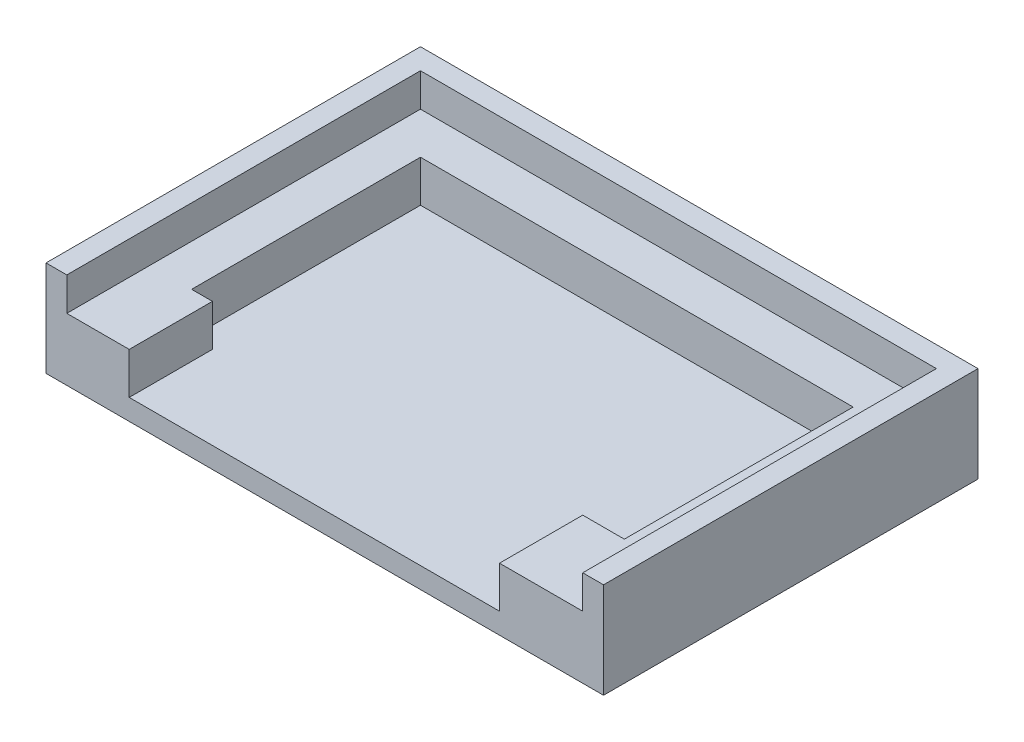
ISO-10303-21;
HEADER;
FILE_DESCRIPTION(('STEP AP214'),'2;1');
FILE_NAME('part.step','',(''),(''),'','','');
FILE_SCHEMA(('AUTOMOTIVE_DESIGN { 1 0 10303 214 1 1 1 1 }'));
ENDSEC;
DATA;
#1=APPLICATION_CONTEXT('core data for automotive mechanical design processes');
#2=APPLICATION_PROTOCOL_DEFINITION('international standard','automotive_design',2000,#1);
#3=PRODUCT_CONTEXT('',#1,'mechanical');
#4=PRODUCT('Part','Part','',(#3));
#5=PRODUCT_RELATED_PRODUCT_CATEGORY('part','',(#4));
#6=PRODUCT_DEFINITION_FORMATION('','',#4);
#7=PRODUCT_DEFINITION_CONTEXT('part definition',#1,'design');
#8=PRODUCT_DEFINITION('design','',#6,#7);
#9=PRODUCT_DEFINITION_SHAPE('','',#8);
#10=(LENGTH_UNIT() NAMED_UNIT(*) SI_UNIT(.MILLI.,.METRE.));
#11=(NAMED_UNIT(*) PLANE_ANGLE_UNIT() SI_UNIT($,.RADIAN.));
#12=(NAMED_UNIT(*) SI_UNIT($,.STERADIAN.) SOLID_ANGLE_UNIT());
#13=UNCERTAINTY_MEASURE_WITH_UNIT(LENGTH_MEASURE(1.E-05),#10,'distance_accuracy_value','');
#14=(GEOMETRIC_REPRESENTATION_CONTEXT(3) GLOBAL_UNCERTAINTY_ASSIGNED_CONTEXT((#13)) GLOBAL_UNIT_ASSIGNED_CONTEXT((#10,
#11,#12)) REPRESENTATION_CONTEXT('',''));
#15=CARTESIAN_POINT('',(0.,0.,0.));
#16=DIRECTION('',(0.,0.,1.));
#17=DIRECTION('',(1.,0.,0.));
#18=AXIS2_PLACEMENT_3D('',#15,#16,#17);
#19=CARTESIAN_POINT('',(67.,5.,45.));
#20=DIRECTION('',(-1.,0.,0.));
#21=DIRECTION('',(0.,0.,1.));
#22=AXIS2_PLACEMENT_3D('',#19,#20,#21);
#23=PLANE('',#22);
#24=DIRECTION('',(0.,0.,-1.));
#25=VECTOR('',#24,1.);
#26=CARTESIAN_POINT('',(67.,0.,45.));
#27=LINE('',#26,#25);
#28=CARTESIAN_POINT('',(67.,0.,45.));
#29=VERTEX_POINT('',#28);
#30=CARTESIAN_POINT('',(67.,0.,-45.));
#31=VERTEX_POINT('',#30);
#32=EDGE_CURVE('E254',#29,#31,#27,.T.);
#33=ORIENTED_EDGE('',*,*,#32,.T.);
#34=DIRECTION('',(0.,-1.,0.));
#35=VECTOR('',#34,1.);
#36=CARTESIAN_POINT('',(67.,5.,-45.));
#37=LINE('',#36,#35);
#38=CARTESIAN_POINT('',(67.,23.,-45.));
#39=VERTEX_POINT('',#38);
#40=EDGE_CURVE('E11',#39,#31,#37,.T.);
#41=ORIENTED_EDGE('',*,*,#40,.F.);
#42=DIRECTION('',(0.,0.,-1.));
#43=VECTOR('',#42,1.);
#44=CARTESIAN_POINT('',(67.,23.,0.));
#45=LINE('',#44,#43);
#46=CARTESIAN_POINT('',(67.,23.,45.));
#47=VERTEX_POINT('',#46);
#48=EDGE_CURVE('E169',#47,#39,#45,.T.);
#49=ORIENTED_EDGE('',*,*,#48,.F.);
#50=DIRECTION('',(0.,-1.,0.));
#51=VECTOR('',#50,1.);
#52=CARTESIAN_POINT('',(67.,5.,45.));
#53=LINE('',#52,#51);
#54=EDGE_CURVE('E257',#47,#29,#53,.T.);
#55=ORIENTED_EDGE('',*,*,#54,.T.);
#56=EDGE_LOOP('',(#33,#41,#49,#55));
#57=FACE_BOUND('',#56,.T.);
#58=ADVANCED_FACE('F35',(#57),#23,.F.);
#59=CARTESIAN_POINT('',(-67.,5.,-45.));
#60=DIRECTION('',(0.,0.,1.));
#61=DIRECTION('',(1.,0.,0.));
#62=AXIS2_PLACEMENT_3D('',#59,#60,#61);
#63=PLANE('',#62);
#64=DIRECTION('',(-1.,0.,0.));
#65=VECTOR('',#64,1.);
#66=CARTESIAN_POINT('',(-67.,0.,-45.));
#67=LINE('',#66,#65);
#68=CARTESIAN_POINT('',(-67.,0.,-45.));
#69=VERTEX_POINT('',#68);
#70=EDGE_CURVE('E261',#31,#69,#67,.T.);
#71=ORIENTED_EDGE('',*,*,#70,.T.);
#72=DIRECTION('',(0.,-1.,0.));
#73=VECTOR('',#72,1.);
#74=CARTESIAN_POINT('',(-67.,5.,-45.));
#75=LINE('',#74,#73);
#76=CARTESIAN_POINT('',(-67.,23.,-45.));
#77=VERTEX_POINT('',#76);
#78=EDGE_CURVE('E42',#77,#69,#75,.T.);
#79=ORIENTED_EDGE('',*,*,#78,.F.);
#80=DIRECTION('',(-1.,0.,0.));
#81=VECTOR('',#80,1.);
#82=CARTESIAN_POINT('',(0.,23.,-45.));
#83=LINE('',#82,#81);
#84=EDGE_CURVE('E174',#39,#77,#83,.T.);
#85=ORIENTED_EDGE('',*,*,#84,.F.);
#86=ORIENTED_EDGE('',*,*,#40,.T.);
#87=EDGE_LOOP('',(#71,#79,#85,#86));
#88=FACE_BOUND('',#87,.T.);
#89=ADVANCED_FACE('F286',(#88),#63,.F.);
#90=CARTESIAN_POINT('',(-67.,5.,45.));
#91=DIRECTION('',(1.,0.,0.));
#92=DIRECTION('',(0.,0.,-1.));
#93=AXIS2_PLACEMENT_3D('',#90,#91,#92);
#94=PLANE('',#93);
#95=DIRECTION('',(0.,0.,1.));
#96=VECTOR('',#95,1.);
#97=CARTESIAN_POINT('',(-67.,0.,45.));
#98=LINE('',#97,#96);
#99=CARTESIAN_POINT('',(-67.,0.,45.));
#100=VERTEX_POINT('',#99);
#101=EDGE_CURVE('E263',#69,#100,#98,.T.);
#102=ORIENTED_EDGE('',*,*,#101,.T.);
#103=DIRECTION('',(0.,-1.,0.));
#104=VECTOR('',#103,1.);
#105=CARTESIAN_POINT('',(-67.,5.,45.));
#106=LINE('',#105,#104);
#107=CARTESIAN_POINT('',(-67.,23.,45.));
#108=VERTEX_POINT('',#107);
#109=EDGE_CURVE('E268',#108,#100,#106,.T.);
#110=ORIENTED_EDGE('',*,*,#109,.F.);
#111=DIRECTION('',(0.,0.,1.));
#112=VECTOR('',#111,1.);
#113=CARTESIAN_POINT('',(-67.,23.,0.));
#114=LINE('',#113,#112);
#115=EDGE_CURVE('E177',#77,#108,#114,.T.);
#116=ORIENTED_EDGE('',*,*,#115,.F.);
#117=ORIENTED_EDGE('',*,*,#78,.T.);
#118=EDGE_LOOP('',(#102,#110,#116,#117));
#119=FACE_BOUND('',#118,.T.);
#120=ADVANCED_FACE('F274',(#119),#94,.F.);
#121=CARTESIAN_POINT('',(-67.,5.,45.));
#122=DIRECTION('',(0.,0.,-1.));
#123=DIRECTION('',(-1.,0.,0.));
#124=AXIS2_PLACEMENT_3D('',#121,#122,#123);
#125=PLANE('',#124);
#126=DIRECTION('',(1.,0.,0.));
#127=VECTOR('',#126,1.);
#128=CARTESIAN_POINT('',(-67.,0.,45.));
#129=LINE('',#128,#127);
#130=EDGE_CURVE('E258',#100,#29,#129,.T.);
#131=ORIENTED_EDGE('',*,*,#130,.T.);
#132=ORIENTED_EDGE('',*,*,#54,.F.);
#133=DIRECTION('',(1.,0.,0.));
#134=VECTOR('',#133,1.);
#135=CARTESIAN_POINT('',(0.,23.,45.));
#136=LINE('',#135,#134);
#137=CARTESIAN_POINT('',(62.,23.,45.));
#138=VERTEX_POINT('',#137);
#139=EDGE_CURVE('E167',#138,#47,#136,.T.);
#140=ORIENTED_EDGE('',*,*,#139,.F.);
#141=DIRECTION('',(0.,-1.,0.));
#142=VECTOR('',#141,1.);
#143=CARTESIAN_POINT('',(62.,23.,45.));
#144=LINE('',#143,#142);
#145=CARTESIAN_POINT('',(62.,15.,45.));
#146=VERTEX_POINT('',#145);
#147=EDGE_CURVE('E153',#138,#146,#144,.T.);
#148=ORIENTED_EDGE('',*,*,#147,.T.);
#149=DIRECTION('',(1.,0.,0.));
#150=VECTOR('',#149,1.);
#151=CARTESIAN_POINT('',(0.,15.,45.));
#152=LINE('',#151,#150);
#153=CARTESIAN_POINT('',(42.,15.,45.));
#154=VERTEX_POINT('',#153);
#155=EDGE_CURVE('E196',#154,#146,#152,.T.);
#156=ORIENTED_EDGE('',*,*,#155,.F.);
#157=DIRECTION('',(0.,-1.,0.));
#158=VECTOR('',#157,1.);
#159=CARTESIAN_POINT('',(42.,15.,45.));
#160=LINE('',#159,#158);
#161=CARTESIAN_POINT('',(42.,5.,45.));
#162=VERTEX_POINT('',#161);
#163=EDGE_CURVE('E251',#154,#162,#160,.T.);
#164=ORIENTED_EDGE('',*,*,#163,.T.);
#165=DIRECTION('',(1.,0.,0.));
#166=VECTOR('',#165,1.);
#167=CARTESIAN_POINT('',(-67.,5.,45.));
#168=LINE('',#167,#166);
#169=CARTESIAN_POINT('',(-47.,5.,45.));
#170=VERTEX_POINT('',#169);
#171=EDGE_CURVE('E255',#170,#162,#168,.T.);
#172=ORIENTED_EDGE('',*,*,#171,.F.);
#173=DIRECTION('',(0.,-1.,0.));
#174=VECTOR('',#173,1.);
#175=CARTESIAN_POINT('',(-47.,15.,45.));
#176=LINE('',#175,#174);
#177=CARTESIAN_POINT('',(-47.,15.,45.));
#178=VERTEX_POINT('',#177);
#179=EDGE_CURVE('E248',#178,#170,#176,.T.);
#180=ORIENTED_EDGE('',*,*,#179,.F.);
#181=CARTESIAN_POINT('',(-62.,15.,45.));
#182=VERTEX_POINT('',#181);
#183=EDGE_CURVE('E200',#182,#178,#152,.T.);
#184=ORIENTED_EDGE('',*,*,#183,.F.);
#185=DIRECTION('',(0.,-1.,0.));
#186=VECTOR('',#185,1.);
#187=CARTESIAN_POINT('',(-62.,23.,45.));
#188=LINE('',#187,#186);
#189=CARTESIAN_POINT('',(-62.,23.,45.));
#190=VERTEX_POINT('',#189);
#191=EDGE_CURVE('E190',#190,#182,#188,.T.);
#192=ORIENTED_EDGE('',*,*,#191,.F.);
#193=DIRECTION('',(1.,0.,0.));
#194=VECTOR('',#193,1.);
#195=CARTESIAN_POINT('',(0.,23.,45.));
#196=LINE('',#195,#194);
#197=EDGE_CURVE('E180',#108,#190,#196,.T.);
#198=ORIENTED_EDGE('',*,*,#197,.F.);
#199=ORIENTED_EDGE('',*,*,#109,.T.);
#200=EDGE_LOOP('',(#131,#132,#140,#148,#156,#164,#172,#180,#184,#192,#198,#199));
#201=FACE_BOUND('',#200,.T.);
#202=ADVANCED_FACE('F282',(#201),#125,.F.);
#203=CARTESIAN_POINT('',(0.,5.,0.));
#204=DIRECTION('',(0.,-1.,0.));
#205=DIRECTION('',(0.,0.,-1.));
#206=AXIS2_PLACEMENT_3D('',#203,#204,#205);
#207=PLANE('',#206);
#208=ORIENTED_EDGE('',*,*,#171,.T.);
#209=DIRECTION('',(0.,0.,-1.));
#210=VECTOR('',#209,1.);
#211=CARTESIAN_POINT('',(42.,5.,0.));
#212=LINE('',#211,#210);
#213=CARTESIAN_POINT('',(42.,5.,25.));
#214=VERTEX_POINT('',#213);
#215=EDGE_CURVE('E57',#162,#214,#212,.T.);
#216=ORIENTED_EDGE('',*,*,#215,.T.);
#217=DIRECTION('',(-1.,0.,0.));
#218=VECTOR('',#217,1.);
#219=CARTESIAN_POINT('',(0.,5.,25.));
#220=LINE('',#219,#218);
#221=CARTESIAN_POINT('',(52.,5.,25.));
#222=VERTEX_POINT('',#221);
#223=EDGE_CURVE('E197',#222,#214,#220,.T.);
#224=ORIENTED_EDGE('',*,*,#223,.F.);
#225=DIRECTION('',(0.,0.,-1.));
#226=VECTOR('',#225,1.);
#227=CARTESIAN_POINT('',(52.,5.,0.));
#228=LINE('',#227,#226);
#229=CARTESIAN_POINT('',(52.,5.,-30.));
#230=VERTEX_POINT('',#229);
#231=EDGE_CURVE('E228',#222,#230,#228,.T.);
#232=ORIENTED_EDGE('',*,*,#231,.T.);
#233=DIRECTION('',(1.,0.,0.));
#234=VECTOR('',#233,1.);
#235=CARTESIAN_POINT('',(0.,5.,-30.));
#236=LINE('',#235,#234);
#237=CARTESIAN_POINT('',(-52.,5.,-30.));
#238=VERTEX_POINT('',#237);
#239=EDGE_CURVE('E225',#238,#230,#236,.T.);
#240=ORIENTED_EDGE('',*,*,#239,.F.);
#241=DIRECTION('',(0.,0.,-1.));
#242=VECTOR('',#241,1.);
#243=CARTESIAN_POINT('',(-52.,5.,0.));
#244=LINE('',#243,#242);
#245=CARTESIAN_POINT('',(-52.,5.,25.));
#246=VERTEX_POINT('',#245);
#247=EDGE_CURVE('E222',#246,#238,#244,.T.);
#248=ORIENTED_EDGE('',*,*,#247,.F.);
#249=DIRECTION('',(-1.,0.,0.));
#250=VECTOR('',#249,1.);
#251=CARTESIAN_POINT('',(0.,5.,25.));
#252=LINE('',#251,#250);
#253=CARTESIAN_POINT('',(-47.,5.,25.));
#254=VERTEX_POINT('',#253);
#255=EDGE_CURVE('E219',#254,#246,#252,.T.);
#256=ORIENTED_EDGE('',*,*,#255,.F.);
#257=DIRECTION('',(0.,0.,-1.));
#258=VECTOR('',#257,1.);
#259=CARTESIAN_POINT('',(-47.,5.,0.));
#260=LINE('',#259,#258);
#261=EDGE_CURVE('E216',#170,#254,#260,.T.);
#262=ORIENTED_EDGE('',*,*,#261,.F.);
#263=EDGE_LOOP('',(#208,#216,#224,#232,#240,#248,#256,#262));
#264=FACE_BOUND('',#263,.T.);
#265=ADVANCED_FACE('F296',(#264),#207,.F.);
#266=CARTESIAN_POINT('',(0.,0.,0.));
#267=DIRECTION('',(0.,-1.,0.));
#268=DIRECTION('',(0.,0.,-1.));
#269=AXIS2_PLACEMENT_3D('',#266,#267,#268);
#270=PLANE('',#269);
#271=ORIENTED_EDGE('',*,*,#32,.F.);
#272=ORIENTED_EDGE('',*,*,#130,.F.);
#273=ORIENTED_EDGE('',*,*,#101,.F.);
#274=ORIENTED_EDGE('',*,*,#70,.F.);
#275=EDGE_LOOP('',(#271,#272,#273,#274));
#276=FACE_BOUND('',#275,.T.);
#277=ADVANCED_FACE('F280',(#276),#270,.T.);
#278=CARTESIAN_POINT('',(42.,15.,0.));
#279=DIRECTION('',(-1.,0.,0.));
#280=DIRECTION('',(0.,0.,1.));
#281=AXIS2_PLACEMENT_3D('',#278,#279,#280);
#282=PLANE('',#281);
#283=ORIENTED_EDGE('',*,*,#215,.F.);
#284=ORIENTED_EDGE('',*,*,#163,.F.);
#285=DIRECTION('',(0.,0.,-1.));
#286=VECTOR('',#285,1.);
#287=CARTESIAN_POINT('',(42.,15.,0.));
#288=LINE('',#287,#286);
#289=CARTESIAN_POINT('',(42.,15.,25.));
#290=VERTEX_POINT('',#289);
#291=EDGE_CURVE('E193',#154,#290,#288,.T.);
#292=ORIENTED_EDGE('',*,*,#291,.T.);
#293=DIRECTION('',(0.,-1.,0.));
#294=VECTOR('',#293,1.);
#295=CARTESIAN_POINT('',(42.,15.,25.));
#296=LINE('',#295,#294);
#297=EDGE_CURVE('E214',#290,#214,#296,.T.);
#298=ORIENTED_EDGE('',*,*,#297,.T.);
#299=EDGE_LOOP('',(#283,#284,#292,#298));
#300=FACE_BOUND('',#299,.T.);
#301=ADVANCED_FACE('F299',(#300),#282,.T.);
#302=CARTESIAN_POINT('',(-47.,15.,0.));
#303=DIRECTION('',(-1.,0.,0.));
#304=DIRECTION('',(0.,0.,1.));
#305=AXIS2_PLACEMENT_3D('',#302,#303,#304);
#306=PLANE('',#305);
#307=ORIENTED_EDGE('',*,*,#261,.T.);
#308=DIRECTION('',(0.,-1.,0.));
#309=VECTOR('',#308,1.);
#310=CARTESIAN_POINT('',(-47.,15.,25.));
#311=LINE('',#310,#309);
#312=CARTESIAN_POINT('',(-47.,15.,25.));
#313=VERTEX_POINT('',#312);
#314=EDGE_CURVE('E245',#313,#254,#311,.T.);
#315=ORIENTED_EDGE('',*,*,#314,.F.);
#316=DIRECTION('',(0.,0.,-1.));
#317=VECTOR('',#316,1.);
#318=CARTESIAN_POINT('',(-47.,15.,0.));
#319=LINE('',#318,#317);
#320=EDGE_CURVE('E201',#178,#313,#319,.T.);
#321=ORIENTED_EDGE('',*,*,#320,.F.);
#322=ORIENTED_EDGE('',*,*,#179,.T.);
#323=EDGE_LOOP('',(#307,#315,#321,#322));
#324=FACE_BOUND('',#323,.T.);
#325=ADVANCED_FACE('F304',(#324),#306,.F.);
#326=CARTESIAN_POINT('',(0.,15.,25.));
#327=DIRECTION('',(0.,0.,1.));
#328=DIRECTION('',(1.,0.,0.));
#329=AXIS2_PLACEMENT_3D('',#326,#327,#328);
#330=PLANE('',#329);
#331=ORIENTED_EDGE('',*,*,#255,.T.);
#332=DIRECTION('',(0.,-1.,0.));
#333=VECTOR('',#332,1.);
#334=CARTESIAN_POINT('',(-52.,15.,25.));
#335=LINE('',#334,#333);
#336=CARTESIAN_POINT('',(-52.,15.,25.));
#337=VERTEX_POINT('',#336);
#338=EDGE_CURVE('E242',#337,#246,#335,.T.);
#339=ORIENTED_EDGE('',*,*,#338,.F.);
#340=DIRECTION('',(-1.,0.,0.));
#341=VECTOR('',#340,1.);
#342=CARTESIAN_POINT('',(0.,15.,25.));
#343=LINE('',#342,#341);
#344=EDGE_CURVE('E203',#313,#337,#343,.T.);
#345=ORIENTED_EDGE('',*,*,#344,.F.);
#346=ORIENTED_EDGE('',*,*,#314,.T.);
#347=EDGE_LOOP('',(#331,#339,#345,#346));
#348=FACE_BOUND('',#347,.T.);
#349=ADVANCED_FACE('F308',(#348),#330,.F.);
#350=CARTESIAN_POINT('',(-52.,15.,0.));
#351=DIRECTION('',(-1.,0.,0.));
#352=DIRECTION('',(0.,0.,1.));
#353=AXIS2_PLACEMENT_3D('',#350,#351,#352);
#354=PLANE('',#353);
#355=ORIENTED_EDGE('',*,*,#247,.T.);
#356=DIRECTION('',(0.,-1.,0.));
#357=VECTOR('',#356,1.);
#358=CARTESIAN_POINT('',(-52.,15.,-30.));
#359=LINE('',#358,#357);
#360=CARTESIAN_POINT('',(-52.,15.,-30.));
#361=VERTEX_POINT('',#360);
#362=EDGE_CURVE('E239',#361,#238,#359,.T.);
#363=ORIENTED_EDGE('',*,*,#362,.F.);
#364=DIRECTION('',(0.,0.,-1.));
#365=VECTOR('',#364,1.);
#366=CARTESIAN_POINT('',(-52.,15.,0.));
#367=LINE('',#366,#365);
#368=EDGE_CURVE('E205',#337,#361,#367,.T.);
#369=ORIENTED_EDGE('',*,*,#368,.F.);
#370=ORIENTED_EDGE('',*,*,#338,.T.);
#371=EDGE_LOOP('',(#355,#363,#369,#370));
#372=FACE_BOUND('',#371,.T.);
#373=ADVANCED_FACE('F312',(#372),#354,.F.);
#374=CARTESIAN_POINT('',(0.,15.,-30.));
#375=DIRECTION('',(0.,0.,-1.));
#376=DIRECTION('',(-1.,0.,0.));
#377=AXIS2_PLACEMENT_3D('',#374,#375,#376);
#378=PLANE('',#377);
#379=ORIENTED_EDGE('',*,*,#239,.T.);
#380=DIRECTION('',(0.,-1.,0.));
#381=VECTOR('',#380,1.);
#382=CARTESIAN_POINT('',(52.,15.,-30.));
#383=LINE('',#382,#381);
#384=CARTESIAN_POINT('',(52.,15.,-30.));
#385=VERTEX_POINT('',#384);
#386=EDGE_CURVE('E236',#385,#230,#383,.T.);
#387=ORIENTED_EDGE('',*,*,#386,.F.);
#388=DIRECTION('',(1.,0.,0.));
#389=VECTOR('',#388,1.);
#390=CARTESIAN_POINT('',(0.,15.,-30.));
#391=LINE('',#390,#389);
#392=EDGE_CURVE('E207',#361,#385,#391,.T.);
#393=ORIENTED_EDGE('',*,*,#392,.F.);
#394=ORIENTED_EDGE('',*,*,#362,.T.);
#395=EDGE_LOOP('',(#379,#387,#393,#394));
#396=FACE_BOUND('',#395,.T.);
#397=ADVANCED_FACE('F316',(#396),#378,.F.);
#398=CARTESIAN_POINT('',(52.,15.,0.));
#399=DIRECTION('',(-1.,0.,0.));
#400=DIRECTION('',(0.,0.,1.));
#401=AXIS2_PLACEMENT_3D('',#398,#399,#400);
#402=PLANE('',#401);
#403=ORIENTED_EDGE('',*,*,#231,.F.);
#404=DIRECTION('',(0.,-1.,0.));
#405=VECTOR('',#404,1.);
#406=CARTESIAN_POINT('',(52.,15.,25.));
#407=LINE('',#406,#405);
#408=CARTESIAN_POINT('',(52.,15.,25.));
#409=VERTEX_POINT('',#408);
#410=EDGE_CURVE('E233',#409,#222,#407,.T.);
#411=ORIENTED_EDGE('',*,*,#410,.F.);
#412=DIRECTION('',(0.,0.,-1.));
#413=VECTOR('',#412,1.);
#414=CARTESIAN_POINT('',(52.,15.,0.));
#415=LINE('',#414,#413);
#416=EDGE_CURVE('E209',#409,#385,#415,.T.);
#417=ORIENTED_EDGE('',*,*,#416,.T.);
#418=ORIENTED_EDGE('',*,*,#386,.T.);
#419=EDGE_LOOP('',(#403,#411,#417,#418));
#420=FACE_BOUND('',#419,.T.);
#421=ADVANCED_FACE('F320',(#420),#402,.T.);
#422=CARTESIAN_POINT('',(0.,15.,25.));
#423=DIRECTION('',(0.,0.,1.));
#424=DIRECTION('',(1.,0.,0.));
#425=AXIS2_PLACEMENT_3D('',#422,#423,#424);
#426=PLANE('',#425);
#427=ORIENTED_EDGE('',*,*,#223,.T.);
#428=ORIENTED_EDGE('',*,*,#297,.F.);
#429=DIRECTION('',(-1.,0.,0.));
#430=VECTOR('',#429,1.);
#431=CARTESIAN_POINT('',(0.,15.,25.));
#432=LINE('',#431,#430);
#433=EDGE_CURVE('E212',#409,#290,#432,.T.);
#434=ORIENTED_EDGE('',*,*,#433,.F.);
#435=ORIENTED_EDGE('',*,*,#410,.T.);
#436=EDGE_LOOP('',(#427,#428,#434,#435));
#437=FACE_BOUND('',#436,.T.);
#438=ADVANCED_FACE('F324',(#437),#426,.F.);
#439=CARTESIAN_POINT('',(0.,15.,0.));
#440=DIRECTION('',(0.,1.,0.));
#441=DIRECTION('',(0.,0.,1.));
#442=AXIS2_PLACEMENT_3D('',#439,#440,#441);
#443=PLANE('',#442);
#444=DIRECTION('',(0.,0.,-1.));
#445=VECTOR('',#444,1.);
#446=CARTESIAN_POINT('',(-62.,15.,0.));
#447=LINE('',#446,#445);
#448=CARTESIAN_POINT('',(-62.,15.,-40.));
#449=VERTEX_POINT('',#448);
#450=EDGE_CURVE('E163',#182,#449,#447,.T.);
#451=ORIENTED_EDGE('',*,*,#450,.F.);
#452=ORIENTED_EDGE('',*,*,#183,.T.);
#453=ORIENTED_EDGE('',*,*,#320,.T.);
#454=ORIENTED_EDGE('',*,*,#344,.T.);
#455=ORIENTED_EDGE('',*,*,#368,.T.);
#456=ORIENTED_EDGE('',*,*,#392,.T.);
#457=ORIENTED_EDGE('',*,*,#416,.F.);
#458=ORIENTED_EDGE('',*,*,#433,.T.);
#459=ORIENTED_EDGE('',*,*,#291,.F.);
#460=ORIENTED_EDGE('',*,*,#155,.T.);
#461=DIRECTION('',(0.,0.,-1.));
#462=VECTOR('',#461,1.);
#463=CARTESIAN_POINT('',(62.,15.,0.));
#464=LINE('',#463,#462);
#465=CARTESIAN_POINT('',(62.,15.,-40.));
#466=VERTEX_POINT('',#465);
#467=EDGE_CURVE('E185',#146,#466,#464,.T.);
#468=ORIENTED_EDGE('',*,*,#467,.T.);
#469=DIRECTION('',(-1.,0.,0.));
#470=VECTOR('',#469,1.);
#471=CARTESIAN_POINT('',(0.,15.,-40.));
#472=LINE('',#471,#470);
#473=EDGE_CURVE('E49',#466,#449,#472,.T.);
#474=ORIENTED_EDGE('',*,*,#473,.T.);
#475=EDGE_LOOP('',(#451,#452,#453,#454,#455,#456,#457,#458,#459,#460,#468,#474));
#476=FACE_BOUND('',#475,.T.);
#477=ADVANCED_FACE('F328',(#476),#443,.T.);
#478=CARTESIAN_POINT('',(0.,23.,-40.));
#479=DIRECTION('',(0.,0.,1.));
#480=DIRECTION('',(1.,0.,0.));
#481=AXIS2_PLACEMENT_3D('',#478,#479,#480);
#482=PLANE('',#481);
#483=ORIENTED_EDGE('',*,*,#473,.F.);
#484=DIRECTION('',(0.,-1.,0.));
#485=VECTOR('',#484,1.);
#486=CARTESIAN_POINT('',(62.,23.,-40.));
#487=LINE('',#486,#485);
#488=CARTESIAN_POINT('',(62.,23.,-40.));
#489=VERTEX_POINT('',#488);
#490=EDGE_CURVE('E145',#489,#466,#487,.T.);
#491=ORIENTED_EDGE('',*,*,#490,.F.);
#492=DIRECTION('',(-1.,0.,0.));
#493=VECTOR('',#492,1.);
#494=CARTESIAN_POINT('',(0.,23.,-40.));
#495=LINE('',#494,#493);
#496=CARTESIAN_POINT('',(-62.,23.,-40.));
#497=VERTEX_POINT('',#496);
#498=EDGE_CURVE('E148',#489,#497,#495,.T.);
#499=ORIENTED_EDGE('',*,*,#498,.T.);
#500=DIRECTION('',(0.,-1.,0.));
#501=VECTOR('',#500,1.);
#502=CARTESIAN_POINT('',(-62.,23.,-40.));
#503=LINE('',#502,#501);
#504=EDGE_CURVE('E183',#497,#449,#503,.T.);
#505=ORIENTED_EDGE('',*,*,#504,.T.);
#506=EDGE_LOOP('',(#483,#491,#499,#505));
#507=FACE_BOUND('',#506,.T.);
#508=ADVANCED_FACE('F147',(#507),#482,.T.);
#509=CARTESIAN_POINT('',(62.,23.,0.));
#510=DIRECTION('',(-1.,0.,0.));
#511=DIRECTION('',(0.,0.,1.));
#512=AXIS2_PLACEMENT_3D('',#509,#510,#511);
#513=PLANE('',#512);
#514=ORIENTED_EDGE('',*,*,#467,.F.);
#515=ORIENTED_EDGE('',*,*,#147,.F.);
#516=DIRECTION('',(0.,0.,-1.));
#517=VECTOR('',#516,1.);
#518=CARTESIAN_POINT('',(62.,23.,0.));
#519=LINE('',#518,#517);
#520=EDGE_CURVE('E159',#138,#489,#519,.T.);
#521=ORIENTED_EDGE('',*,*,#520,.T.);
#522=ORIENTED_EDGE('',*,*,#490,.T.);
#523=EDGE_LOOP('',(#514,#515,#521,#522));
#524=FACE_BOUND('',#523,.T.);
#525=ADVANCED_FACE('F165',(#524),#513,.T.);
#526=CARTESIAN_POINT('',(-62.,23.,0.));
#527=DIRECTION('',(-1.,0.,0.));
#528=DIRECTION('',(0.,0.,1.));
#529=AXIS2_PLACEMENT_3D('',#526,#527,#528);
#530=PLANE('',#529);
#531=ORIENTED_EDGE('',*,*,#450,.T.);
#532=ORIENTED_EDGE('',*,*,#504,.F.);
#533=DIRECTION('',(0.,0.,-1.));
#534=VECTOR('',#533,1.);
#535=CARTESIAN_POINT('',(-62.,23.,0.));
#536=LINE('',#535,#534);
#537=EDGE_CURVE('E161',#190,#497,#536,.T.);
#538=ORIENTED_EDGE('',*,*,#537,.F.);
#539=ORIENTED_EDGE('',*,*,#191,.T.);
#540=EDGE_LOOP('',(#531,#532,#538,#539));
#541=FACE_BOUND('',#540,.T.);
#542=ADVANCED_FACE('F337',(#541),#530,.F.);
#543=CARTESIAN_POINT('',(0.,23.,0.));
#544=DIRECTION('',(0.,1.,0.));
#545=DIRECTION('',(0.,0.,1.));
#546=AXIS2_PLACEMENT_3D('',#543,#544,#545);
#547=PLANE('',#546);
#548=ORIENTED_EDGE('',*,*,#498,.F.);
#549=ORIENTED_EDGE('',*,*,#520,.F.);
#550=ORIENTED_EDGE('',*,*,#139,.T.);
#551=ORIENTED_EDGE('',*,*,#48,.T.);
#552=ORIENTED_EDGE('',*,*,#84,.T.);
#553=ORIENTED_EDGE('',*,*,#115,.T.);
#554=ORIENTED_EDGE('',*,*,#197,.T.);
#555=ORIENTED_EDGE('',*,*,#537,.T.);
#556=EDGE_LOOP('',(#548,#549,#550,#551,#552,#553,#554,#555));
#557=FACE_BOUND('',#556,.T.);
#558=ADVANCED_FACE('F157',(#557),#547,.T.);
#559=CLOSED_SHELL('',(#58,#89,#120,#202,#265,#277,#301,#325,#349,#373,#397,#421,#438,#477,#508,
#525,#542,#558));
#560=MANIFOLD_SOLID_BREP('B2',#559);
#561=ADVANCED_BREP_SHAPE_REPRESENTATION('',(#18,#560),#14);
#562=SHAPE_DEFINITION_REPRESENTATION(#9,#561);
ENDSEC;
END-ISO-10303-21;
